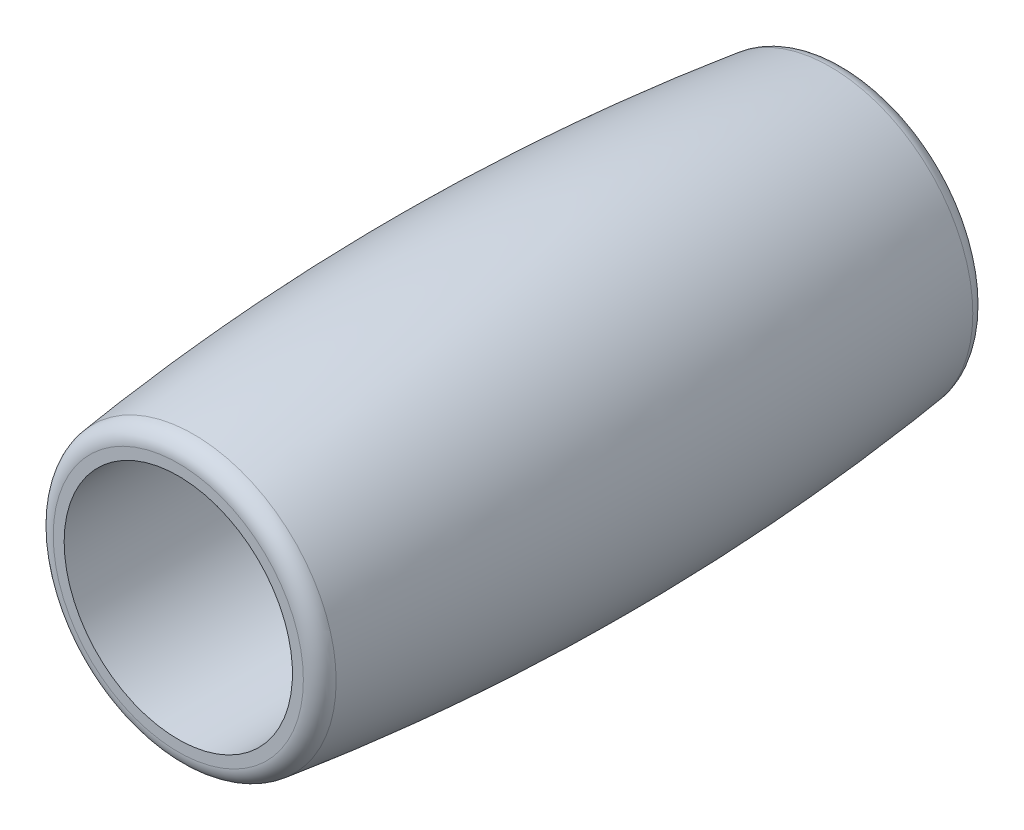
ISO-10303-21;
HEADER;
FILE_DESCRIPTION(('STEP AP214'),'2;1');
FILE_NAME('part.step','',(''),(''),'','','');
FILE_SCHEMA(('AUTOMOTIVE_DESIGN { 1 0 10303 214 1 1 1 1 }'));
ENDSEC;
DATA;
#1=APPLICATION_CONTEXT('core data for automotive mechanical design processes');
#2=APPLICATION_PROTOCOL_DEFINITION('international standard','automotive_design',2000,#1);
#3=PRODUCT_CONTEXT('',#1,'mechanical');
#4=PRODUCT('Part','Part','',(#3));
#5=PRODUCT_RELATED_PRODUCT_CATEGORY('part','',(#4));
#6=PRODUCT_DEFINITION_FORMATION('','',#4);
#7=PRODUCT_DEFINITION_CONTEXT('part definition',#1,'design');
#8=PRODUCT_DEFINITION('design','',#6,#7);
#9=PRODUCT_DEFINITION_SHAPE('','',#8);
#10=(LENGTH_UNIT() NAMED_UNIT(*) SI_UNIT(.MILLI.,.METRE.));
#11=(NAMED_UNIT(*) PLANE_ANGLE_UNIT() SI_UNIT($,.RADIAN.));
#12=(NAMED_UNIT(*) SI_UNIT($,.STERADIAN.) SOLID_ANGLE_UNIT());
#13=UNCERTAINTY_MEASURE_WITH_UNIT(LENGTH_MEASURE(1.E-05),#10,'distance_accuracy_value','');
#14=(GEOMETRIC_REPRESENTATION_CONTEXT(3) GLOBAL_UNCERTAINTY_ASSIGNED_CONTEXT((#13)) GLOBAL_UNIT_ASSIGNED_CONTEXT((#10,
#11,#12)) REPRESENTATION_CONTEXT('',''));
#15=CARTESIAN_POINT('',(0.,0.,0.));
#16=DIRECTION('',(0.,0.,1.));
#17=DIRECTION('',(1.,0.,0.));
#18=AXIS2_PLACEMENT_3D('',#15,#16,#17);
#19=CARTESIAN_POINT('',(0.,0.,-17.5604191692568));
#20=DIRECTION('',(0.,0.,-1.));
#21=DIRECTION('',(-1.,0.,0.));
#22=AXIS2_PLACEMENT_3D('',#19,#20,#21);
#23=CYLINDRICAL_SURFACE('',#22,6.5);
#24=CARTESIAN_POINT('',(0.,0.,18.4028850945748));
#25=DIRECTION('',(0.,0.,-1.));
#26=DIRECTION('',(-1.,0.,0.));
#27=AXIS2_PLACEMENT_3D('',#24,#25,#26);
#28=CIRCLE('',#27,6.5);
#29=CARTESIAN_POINT('',(-6.5,0.,18.4028850945748));
#30=VERTEX_POINT('',#29);
#31=EDGE_CURVE('E190',#30,#30,#28,.F.);
#32=ORIENTED_EDGE('',*,*,#31,.T.);
#33=EDGE_LOOP('',(#32));
#34=FACE_BOUND('',#33,.T.);
#35=CARTESIAN_POINT('',(0.,0.,-19.5971149054252));
#36=DIRECTION('',(0.,0.,-1.));
#37=DIRECTION('',(-1.,0.,0.));
#38=AXIS2_PLACEMENT_3D('',#35,#36,#37);
#39=CIRCLE('',#38,6.5);
#40=CARTESIAN_POINT('',(-6.5,0.,-19.5971149054252));
#41=VERTEX_POINT('',#40);
#42=EDGE_CURVE('E52',#41,#41,#39,.T.);
#43=ORIENTED_EDGE('',*,*,#42,.T.);
#44=EDGE_LOOP('',(#43));
#45=FACE_BOUND('',#44,.T.);
#46=ADVANCED_FACE('F17',(#34,#45),#23,.F.);
#47=CARTESIAN_POINT('',(6.50000000000001,0.,18.4028850945748));
#48=DIRECTION('',(0.,0.,-1.));
#49=DIRECTION('',(-1.,0.,0.));
#50=AXIS2_PLACEMENT_3D('',#47,#48,#49);
#51=PLANE('',#50);
#52=ORIENTED_EDGE('',*,*,#31,.F.);
#53=EDGE_LOOP('',(#52));
#54=FACE_BOUND('',#53,.T.);
#55=CARTESIAN_POINT('',(0.,0.,18.4028850945748));
#56=DIRECTION('',(0.,0.,-1.));
#57=DIRECTION('',(-1.,0.,0.));
#58=AXIS2_PLACEMENT_3D('',#55,#56,#57);
#59=CIRCLE('',#58,7.120768394309);
#60=CARTESIAN_POINT('',(-7.120768394309,0.,18.4028850945748));
#61=VERTEX_POINT('',#60);
#62=CARTESIAN_POINT('',(7.120768394309,0.,18.4028850945748));
#63=VERTEX_POINT('',#62);
#64=EDGE_CURVE('E45',#61,#63,#59,.T.);
#65=ORIENTED_EDGE('',*,*,#64,.F.);
#66=CARTESIAN_POINT('',(0.,0.,18.4028850945748));
#67=DIRECTION('',(0.,0.,-1.));
#68=DIRECTION('',(1.,0.,0.));
#69=AXIS2_PLACEMENT_3D('',#66,#67,#68);
#70=CIRCLE('',#69,7.120768394309);
#71=EDGE_CURVE('E48',#63,#61,#70,.T.);
#72=ORIENTED_EDGE('',*,*,#71,.F.);
#73=EDGE_LOOP('',(#65,#72));
#74=FACE_BOUND('',#73,.T.);
#75=ADVANCED_FACE('F50',(#54,#74),#51,.F.);
#76=CARTESIAN_POINT('',(8.,0.,-19.5971149054252));
#77=DIRECTION('',(0.,0.,1.));
#78=DIRECTION('',(1.,0.,0.));
#79=AXIS2_PLACEMENT_3D('',#76,#77,#78);
#80=PLANE('',#79);
#81=ORIENTED_EDGE('',*,*,#42,.F.);
#82=EDGE_LOOP('',(#81));
#83=FACE_BOUND('',#82,.T.);
#84=CARTESIAN_POINT('',(0.,0.,-19.5971149054252));
#85=DIRECTION('',(0.,0.,1.));
#86=DIRECTION('',(1.,0.,0.));
#87=AXIS2_PLACEMENT_3D('',#84,#85,#86);
#88=CIRCLE('',#87,7.120768394309);
#89=CARTESIAN_POINT('',(7.120768394309,0.,-19.5971149054252));
#90=VERTEX_POINT('',#89);
#91=CARTESIAN_POINT('',(-7.120768394309,0.,-19.5971149054252));
#92=VERTEX_POINT('',#91);
#93=EDGE_CURVE('E57',#90,#92,#88,.T.);
#94=ORIENTED_EDGE('',*,*,#93,.F.);
#95=CARTESIAN_POINT('',(0.,0.,-19.5971149054252));
#96=DIRECTION('',(0.,0.,1.));
#97=DIRECTION('',(-1.,0.,0.));
#98=AXIS2_PLACEMENT_3D('',#95,#96,#97);
#99=CIRCLE('',#98,7.120768394309);
#100=EDGE_CURVE('E36',#92,#90,#99,.T.);
#101=ORIENTED_EDGE('',*,*,#100,.F.);
#102=EDGE_LOOP('',(#94,#101));
#103=FACE_BOUND('',#102,.T.);
#104=ADVANCED_FACE('F76',(#83,#103),#80,.F.);
#105=CARTESIAN_POINT('',(0.,0.,17.4028850945748));
#106=DIRECTION('',(0.,0.,-1.));
#107=DIRECTION('',(-1.,0.,0.));
#108=AXIS2_PLACEMENT_3D('',#105,#106,#107);
#109=TOROIDAL_SURFACE('',#108,7.120768394309,1.);
#110=CARTESIAN_POINT('',(0.,0.,17.5278633969529));
#111=DIRECTION('',(0.,0.,-1.));
#112=DIRECTION('',(-1.,0.,0.));
#113=AXIS2_PLACEMENT_3D('',#110,#111,#112);
#114=CIRCLE('',#113,8.11292786936063);
#115=CARTESIAN_POINT('',(-8.11292786936063,0.,17.5278633969529));
#116=VERTEX_POINT('',#115);
#117=EDGE_CURVE('E28',#116,#116,#114,.T.);
#118=ORIENTED_EDGE('',*,*,#117,.F.);
#119=EDGE_LOOP('',(#118));
#120=FACE_BOUND('',#119,.T.);
#121=ORIENTED_EDGE('',*,*,#64,.T.);
#122=ORIENTED_EDGE('',*,*,#71,.T.);
#123=EDGE_LOOP('',(#121,#122));
#124=FACE_BOUND('',#123,.T.);
#125=ADVANCED_FACE('F56',(#120,#124),#109,.T.);
#126=CARTESIAN_POINT('',(0.,0.,-18.5971149054252));
#127=DIRECTION('',(0.,0.,1.));
#128=DIRECTION('',(1.,0.,0.));
#129=AXIS2_PLACEMENT_3D('',#126,#127,#128);
#130=TOROIDAL_SURFACE('',#129,7.120768394309,1.);
#131=CARTESIAN_POINT('',(0.,0.,-18.7220932078033));
#132=DIRECTION('',(0.,0.,-1.));
#133=DIRECTION('',(-1.,0.,0.));
#134=AXIS2_PLACEMENT_3D('',#131,#132,#133);
#135=CIRCLE('',#134,8.11292786936063);
#136=CARTESIAN_POINT('',(-8.11292786936063,0.,-18.7220932078033));
#137=VERTEX_POINT('',#136);
#138=EDGE_CURVE('E11',#137,#137,#135,.F.);
#139=ORIENTED_EDGE('',*,*,#138,.F.);
#140=EDGE_LOOP('',(#139));
#141=FACE_BOUND('',#140,.T.);
#142=ORIENTED_EDGE('',*,*,#93,.T.);
#143=ORIENTED_EDGE('',*,*,#100,.T.);
#144=EDGE_LOOP('',(#142,#143));
#145=FACE_BOUND('',#144,.T.);
#146=ADVANCED_FACE('F75',(#141,#145),#130,.T.);
#147=CARTESIAN_POINT('',(135.775,0.,-0.597114905425218));
#148=DIRECTION('',(0.,1.,0.));
#149=DIRECTION('',(-1.,0.,0.));
#150=AXIS2_PLACEMENT_3D('',#147,#148,#149);
#151=CIRCLE('',#150,145.025);
#152=TRIMMED_CURVE('',#151,(PARAMETER_VALUE(-0.359087473719208)),
(PARAMETER_VALUE(0.359087473719208)),.T.,.PARAMETER.);
#153=CARTESIAN_POINT('',(0.,0.,-0.597114905425203));
#154=DIRECTION('',(0.,0.,-1.));
#155=AXIS1_PLACEMENT('',#153,#154);
#156=SURFACE_OF_REVOLUTION('',#152,#155);
#157=ORIENTED_EDGE('',*,*,#138,.T.);
#158=EDGE_LOOP('',(#157));
#159=FACE_BOUND('',#158,.T.);
#160=ORIENTED_EDGE('',*,*,#117,.T.);
#161=EDGE_LOOP('',(#160));
#162=FACE_BOUND('',#161,.T.);
#163=ADVANCED_FACE('F133',(#159,#162),#156,.F.);
#164=CLOSED_SHELL('',(#46,#75,#104,#125,#146,#163));
#165=MANIFOLD_SOLID_BREP('B1',#164);
#166=ADVANCED_BREP_SHAPE_REPRESENTATION('',(#18,#165),#14);
#167=SHAPE_DEFINITION_REPRESENTATION(#9,#166);
ENDSEC;
END-ISO-10303-21;
